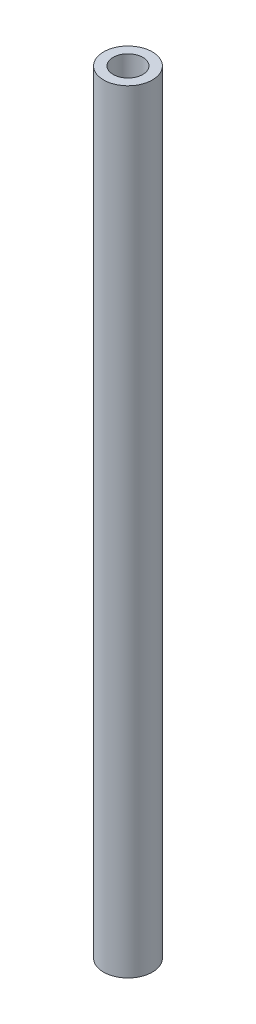
ISO-10303-21;
HEADER;
FILE_DESCRIPTION(('STEP AP214'),'2;1');
FILE_NAME('part.step','',(''),(''),'','','');
FILE_SCHEMA(('AUTOMOTIVE_DESIGN { 1 0 10303 214 1 1 1 1 }'));
ENDSEC;
DATA;
#1=APPLICATION_CONTEXT('core data for automotive mechanical design processes');
#2=APPLICATION_PROTOCOL_DEFINITION('international standard','automotive_design',2000,#1);
#3=PRODUCT_CONTEXT('',#1,'mechanical');
#4=PRODUCT('Part','Part','',(#3));
#5=PRODUCT_RELATED_PRODUCT_CATEGORY('part','',(#4));
#6=PRODUCT_DEFINITION_FORMATION('','',#4);
#7=PRODUCT_DEFINITION_CONTEXT('part definition',#1,'design');
#8=PRODUCT_DEFINITION('design','',#6,#7);
#9=PRODUCT_DEFINITION_SHAPE('','',#8);
#10=(LENGTH_UNIT() NAMED_UNIT(*) SI_UNIT(.MILLI.,.METRE.));
#11=(NAMED_UNIT(*) PLANE_ANGLE_UNIT() SI_UNIT($,.RADIAN.));
#12=(NAMED_UNIT(*) SI_UNIT($,.STERADIAN.) SOLID_ANGLE_UNIT());
#13=UNCERTAINTY_MEASURE_WITH_UNIT(LENGTH_MEASURE(1.E-05),#10,'distance_accuracy_value','');
#14=(GEOMETRIC_REPRESENTATION_CONTEXT(3) GLOBAL_UNCERTAINTY_ASSIGNED_CONTEXT((#13)) GLOBAL_UNIT_ASSIGNED_CONTEXT((#10,
#11,#12)) REPRESENTATION_CONTEXT('',''));
#15=CARTESIAN_POINT('',(0.,0.,0.));
#16=DIRECTION('',(0.,0.,1.));
#17=DIRECTION('',(1.,0.,0.));
#18=AXIS2_PLACEMENT_3D('',#15,#16,#17);
#19=CARTESIAN_POINT('',(0.,2.6,0.));
#20=DIRECTION('',(0.,1.,0.));
#21=DIRECTION('',(0.,0.,1.));
#22=AXIS2_PLACEMENT_3D('',#19,#20,#21);
#23=PLANE('',#22);
#24=CARTESIAN_POINT('',(0.,2.6,0.));
#25=DIRECTION('',(0.,1.,0.));
#26=DIRECTION('',(0.,0.,1.));
#27=AXIS2_PLACEMENT_3D('',#24,#25,#26);
#28=CIRCLE('',#27,0.082);
#29=CARTESIAN_POINT('',(0.,2.6,0.082));
#30=VERTEX_POINT('',#29);
#31=EDGE_CURVE('E10',#30,#30,#28,.T.);
#32=ORIENTED_EDGE('',*,*,#31,.T.);
#33=EDGE_LOOP('',(#32));
#34=FACE_BOUND('',#33,.T.);
#35=CARTESIAN_POINT('',(0.,2.6,0.));
#36=DIRECTION('',(0.,1.,0.));
#37=DIRECTION('',(0.,0.,1.));
#38=AXIS2_PLACEMENT_3D('',#35,#36,#37);
#39=CIRCLE('',#38,0.05);
#40=CARTESIAN_POINT('',(0.,2.6,0.05));
#41=VERTEX_POINT('',#40);
#42=EDGE_CURVE('E50',#41,#41,#39,.T.);
#43=ORIENTED_EDGE('',*,*,#42,.F.);
#44=EDGE_LOOP('',(#43));
#45=FACE_BOUND('',#44,.T.);
#46=ADVANCED_FACE('F37',(#34,#45),#23,.T.);
#47=CARTESIAN_POINT('',(0.,0.,0.));
#48=DIRECTION('',(0.,1.,0.));
#49=DIRECTION('',(0.,0.,1.));
#50=AXIS2_PLACEMENT_3D('',#47,#48,#49);
#51=PLANE('',#50);
#52=CARTESIAN_POINT('',(0.,0.,0.));
#53=DIRECTION('',(0.,1.,0.));
#54=DIRECTION('',(0.,0.,1.));
#55=AXIS2_PLACEMENT_3D('',#52,#53,#54);
#56=CIRCLE('',#55,0.082);
#57=CARTESIAN_POINT('',(0.,0.,0.082));
#58=VERTEX_POINT('',#57);
#59=EDGE_CURVE('E41',#58,#58,#56,.T.);
#60=ORIENTED_EDGE('',*,*,#59,.F.);
#61=EDGE_LOOP('',(#60));
#62=FACE_BOUND('',#61,.T.);
#63=CARTESIAN_POINT('',(0.,0.,0.));
#64=DIRECTION('',(0.,1.,0.));
#65=DIRECTION('',(0.,0.,1.));
#66=AXIS2_PLACEMENT_3D('',#63,#64,#65);
#67=CIRCLE('',#66,0.05);
#68=CARTESIAN_POINT('',(0.,0.,0.05));
#69=VERTEX_POINT('',#68);
#70=EDGE_CURVE('E52',#69,#69,#67,.T.);
#71=ORIENTED_EDGE('',*,*,#70,.T.);
#72=EDGE_LOOP('',(#71));
#73=FACE_BOUND('',#72,.T.);
#74=ADVANCED_FACE('F64',(#62,#73),#51,.F.);
#75=CARTESIAN_POINT('',(0.,2.6,0.));
#76=DIRECTION('',(0.,-1.,0.));
#77=DIRECTION('',(0.,0.,-1.));
#78=AXIS2_PLACEMENT_3D('',#75,#76,#77);
#79=CYLINDRICAL_SURFACE('',#78,0.082);
#80=ORIENTED_EDGE('',*,*,#31,.F.);
#81=EDGE_LOOP('',(#80));
#82=FACE_BOUND('',#81,.T.);
#83=ORIENTED_EDGE('',*,*,#59,.T.);
#84=EDGE_LOOP('',(#83));
#85=FACE_BOUND('',#84,.T.);
#86=ADVANCED_FACE('F39',(#82,#85),#79,.T.);
#87=CARTESIAN_POINT('',(0.,2.6,0.));
#88=DIRECTION('',(0.,-1.,0.));
#89=DIRECTION('',(0.,0.,-1.));
#90=AXIS2_PLACEMENT_3D('',#87,#88,#89);
#91=CYLINDRICAL_SURFACE('',#90,0.05);
#92=ORIENTED_EDGE('',*,*,#42,.T.);
#93=EDGE_LOOP('',(#92));
#94=FACE_BOUND('',#93,.T.);
#95=ORIENTED_EDGE('',*,*,#70,.F.);
#96=EDGE_LOOP('',(#95));
#97=FACE_BOUND('',#96,.T.);
#98=ADVANCED_FACE('F60',(#94,#97),#91,.F.);
#99=CLOSED_SHELL('',(#46,#74,#86,#98));
#100=MANIFOLD_SOLID_BREP('B2',#99);
#101=ADVANCED_BREP_SHAPE_REPRESENTATION('',(#18,#100),#14);
#102=SHAPE_DEFINITION_REPRESENTATION(#9,#101);
ENDSEC;
END-ISO-10303-21;
